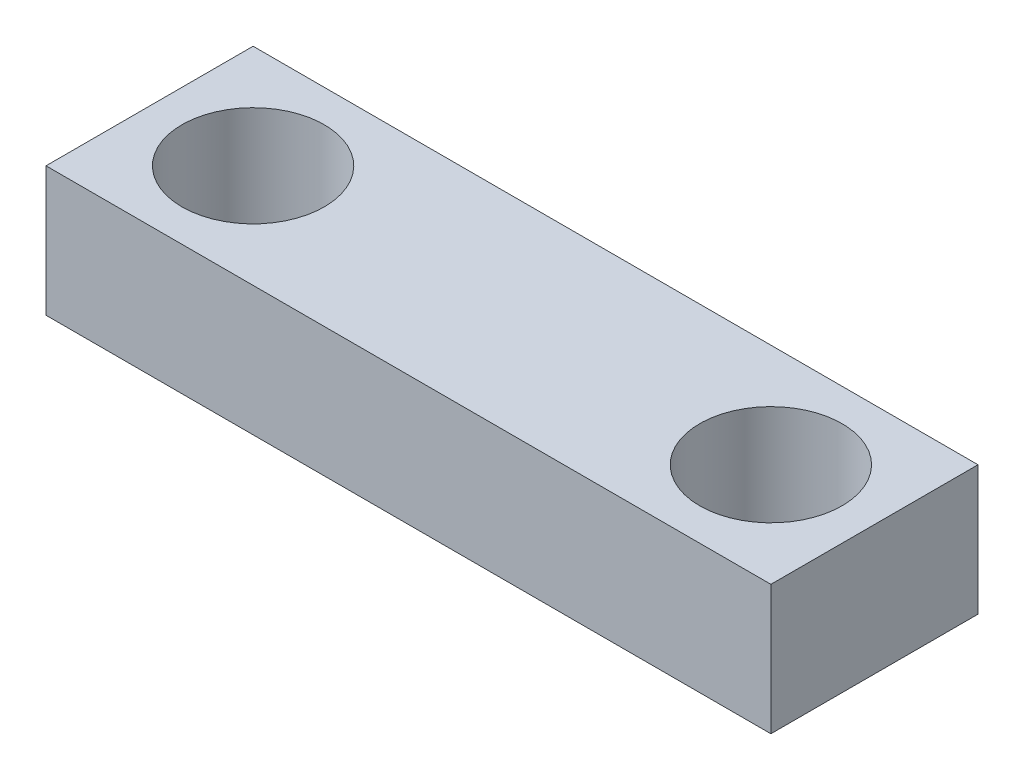
ISO-10303-21;
HEADER;
FILE_DESCRIPTION(('STEP AP214'),'2;1');
FILE_NAME('part.step','',(''),(''),'','','');
FILE_SCHEMA(('AUTOMOTIVE_DESIGN { 1 0 10303 214 1 1 1 1 }'));
ENDSEC;
DATA;
#1=APPLICATION_CONTEXT('core data for automotive mechanical design processes');
#2=APPLICATION_PROTOCOL_DEFINITION('international standard','automotive_design',2000,#1);
#3=PRODUCT_CONTEXT('',#1,'mechanical');
#4=PRODUCT('Part','Part','',(#3));
#5=PRODUCT_RELATED_PRODUCT_CATEGORY('part','',(#4));
#6=PRODUCT_DEFINITION_FORMATION('','',#4);
#7=PRODUCT_DEFINITION_CONTEXT('part definition',#1,'design');
#8=PRODUCT_DEFINITION('design','',#6,#7);
#9=PRODUCT_DEFINITION_SHAPE('','',#8);
#10=(LENGTH_UNIT() NAMED_UNIT(*) SI_UNIT(.MILLI.,.METRE.));
#11=(NAMED_UNIT(*) PLANE_ANGLE_UNIT() SI_UNIT($,.RADIAN.));
#12=(NAMED_UNIT(*) SI_UNIT($,.STERADIAN.) SOLID_ANGLE_UNIT());
#13=UNCERTAINTY_MEASURE_WITH_UNIT(LENGTH_MEASURE(1.E-05),#10,'distance_accuracy_value','');
#14=(GEOMETRIC_REPRESENTATION_CONTEXT(3) GLOBAL_UNCERTAINTY_ASSIGNED_CONTEXT((#13)) GLOBAL_UNIT_ASSIGNED_CONTEXT((#10,
#11,#12)) REPRESENTATION_CONTEXT('',''));
#15=CARTESIAN_POINT('',(0.,0.,0.));
#16=DIRECTION('',(0.,0.,1.));
#17=DIRECTION('',(1.,0.,0.));
#18=AXIS2_PLACEMENT_3D('',#15,#16,#17);
#19=CARTESIAN_POINT('',(0.,5.,0.));
#20=DIRECTION('',(0.,-1.,0.));
#21=DIRECTION('',(0.,0.,-1.));
#22=AXIS2_PLACEMENT_3D('',#19,#20,#21);
#23=PLANE('',#22);
#24=DIRECTION('',(0.,0.,-1.));
#25=VECTOR('',#24,1.);
#26=CARTESIAN_POINT('',(14.,5.,4.));
#27=LINE('',#26,#25);
#28=CARTESIAN_POINT('',(14.,5.,4.));
#29=VERTEX_POINT('',#28);
#30=CARTESIAN_POINT('',(14.,5.,-4.));
#31=VERTEX_POINT('',#30);
#32=EDGE_CURVE('E98',#29,#31,#27,.T.);
#33=ORIENTED_EDGE('',*,*,#32,.T.);
#34=DIRECTION('',(-1.,0.,0.));
#35=VECTOR('',#34,1.);
#36=CARTESIAN_POINT('',(-14.,5.,-4.));
#37=LINE('',#36,#35);
#38=CARTESIAN_POINT('',(-14.,5.,-4.));
#39=VERTEX_POINT('',#38);
#40=EDGE_CURVE('E93',#31,#39,#37,.T.);
#41=ORIENTED_EDGE('',*,*,#40,.T.);
#42=DIRECTION('',(0.,0.,1.));
#43=VECTOR('',#42,1.);
#44=CARTESIAN_POINT('',(-14.,5.,4.));
#45=LINE('',#44,#43);
#46=CARTESIAN_POINT('',(-14.,5.,4.));
#47=VERTEX_POINT('',#46);
#48=EDGE_CURVE('E96',#39,#47,#45,.T.);
#49=ORIENTED_EDGE('',*,*,#48,.T.);
#50=DIRECTION('',(1.,0.,0.));
#51=VECTOR('',#50,1.);
#52=CARTESIAN_POINT('',(-14.,5.,4.));
#53=LINE('',#52,#51);
#54=EDGE_CURVE('E63',#47,#29,#53,.T.);
#55=ORIENTED_EDGE('',*,*,#54,.T.);
#56=EDGE_LOOP('',(#33,#41,#49,#55));
#57=FACE_BOUND('',#56,.T.);
#58=CARTESIAN_POINT('',(10.,5.,0.));
#59=DIRECTION('',(0.,1.,0.));
#60=DIRECTION('',(0.,0.,1.));
#61=AXIS2_PLACEMENT_3D('',#58,#59,#60);
#62=CIRCLE('',#61,2.75);
#63=CARTESIAN_POINT('',(10.,5.,2.75));
#64=VERTEX_POINT('',#63);
#65=EDGE_CURVE('E119',#64,#64,#62,.T.);
#66=ORIENTED_EDGE('',*,*,#65,.F.);
#67=EDGE_LOOP('',(#66));
#68=FACE_BOUND('',#67,.T.);
#69=CARTESIAN_POINT('',(-10.,5.,0.));
#70=DIRECTION('',(0.,1.,0.));
#71=DIRECTION('',(0.,0.,1.));
#72=AXIS2_PLACEMENT_3D('',#69,#70,#71);
#73=CIRCLE('',#72,2.75);
#74=CARTESIAN_POINT('',(-10.,5.,2.75));
#75=VERTEX_POINT('',#74);
#76=EDGE_CURVE('E143',#75,#75,#73,.T.);
#77=ORIENTED_EDGE('',*,*,#76,.F.);
#78=EDGE_LOOP('',(#77));
#79=FACE_BOUND('',#78,.T.);
#80=ADVANCED_FACE('F45',(#57,#68,#79),#23,.F.);
#81=CARTESIAN_POINT('',(0.,0.,0.));
#82=DIRECTION('',(0.,-1.,0.));
#83=DIRECTION('',(0.,0.,-1.));
#84=AXIS2_PLACEMENT_3D('',#81,#82,#83);
#85=PLANE('',#84);
#86=CARTESIAN_POINT('',(10.,0.,0.));
#87=DIRECTION('',(0.,1.,0.));
#88=DIRECTION('',(0.,0.,1.));
#89=AXIS2_PLACEMENT_3D('',#86,#87,#88);
#90=CIRCLE('',#89,2.75);
#91=CARTESIAN_POINT('',(10.,0.,2.75));
#92=VERTEX_POINT('',#91);
#93=EDGE_CURVE('E139',#92,#92,#90,.T.);
#94=ORIENTED_EDGE('',*,*,#93,.T.);
#95=EDGE_LOOP('',(#94));
#96=FACE_BOUND('',#95,.T.);
#97=DIRECTION('',(0.,0.,-1.));
#98=VECTOR('',#97,1.);
#99=CARTESIAN_POINT('',(14.,0.,4.));
#100=LINE('',#99,#98);
#101=CARTESIAN_POINT('',(14.,0.,4.));
#102=VERTEX_POINT('',#101);
#103=CARTESIAN_POINT('',(14.,0.,-4.));
#104=VERTEX_POINT('',#103);
#105=EDGE_CURVE('E115',#102,#104,#100,.T.);
#106=ORIENTED_EDGE('',*,*,#105,.F.);
#107=DIRECTION('',(1.,0.,0.));
#108=VECTOR('',#107,1.);
#109=CARTESIAN_POINT('',(-14.,0.,4.));
#110=LINE('',#109,#108);
#111=CARTESIAN_POINT('',(-14.,0.,4.));
#112=VERTEX_POINT('',#111);
#113=EDGE_CURVE('E86',#112,#102,#110,.T.);
#114=ORIENTED_EDGE('',*,*,#113,.F.);
#115=DIRECTION('',(0.,0.,1.));
#116=VECTOR('',#115,1.);
#117=CARTESIAN_POINT('',(-14.,0.,4.));
#118=LINE('',#117,#116);
#119=CARTESIAN_POINT('',(-14.,0.,-4.));
#120=VERTEX_POINT('',#119);
#121=EDGE_CURVE('E80',#120,#112,#118,.T.);
#122=ORIENTED_EDGE('',*,*,#121,.F.);
#123=DIRECTION('',(-1.,0.,0.));
#124=VECTOR('',#123,1.);
#125=CARTESIAN_POINT('',(-14.,0.,-4.));
#126=LINE('',#125,#124);
#127=EDGE_CURVE('E103',#104,#120,#126,.T.);
#128=ORIENTED_EDGE('',*,*,#127,.F.);
#129=EDGE_LOOP('',(#106,#114,#122,#128));
#130=FACE_BOUND('',#129,.T.);
#131=CARTESIAN_POINT('',(-10.,0.,0.));
#132=DIRECTION('',(0.,1.,0.));
#133=DIRECTION('',(0.,0.,1.));
#134=AXIS2_PLACEMENT_3D('',#131,#132,#133);
#135=CIRCLE('',#134,2.75);
#136=CARTESIAN_POINT('',(-10.,0.,2.75));
#137=VERTEX_POINT('',#136);
#138=EDGE_CURVE('E147',#137,#137,#135,.T.);
#139=ORIENTED_EDGE('',*,*,#138,.T.);
#140=EDGE_LOOP('',(#139));
#141=FACE_BOUND('',#140,.T.);
#142=ADVANCED_FACE('F133',(#96,#130,#141),#85,.T.);
#143=CARTESIAN_POINT('',(14.,5.,4.));
#144=DIRECTION('',(-1.,0.,0.));
#145=DIRECTION('',(0.,0.,1.));
#146=AXIS2_PLACEMENT_3D('',#143,#144,#145);
#147=PLANE('',#146);
#148=ORIENTED_EDGE('',*,*,#105,.T.);
#149=DIRECTION('',(0.,-1.,0.));
#150=VECTOR('',#149,1.);
#151=CARTESIAN_POINT('',(14.,5.,-4.));
#152=LINE('',#151,#150);
#153=EDGE_CURVE('E11',#31,#104,#152,.T.);
#154=ORIENTED_EDGE('',*,*,#153,.F.);
#155=ORIENTED_EDGE('',*,*,#32,.F.);
#156=DIRECTION('',(0.,-1.,0.));
#157=VECTOR('',#156,1.);
#158=CARTESIAN_POINT('',(14.,5.,4.));
#159=LINE('',#158,#157);
#160=EDGE_CURVE('E111',#29,#102,#159,.T.);
#161=ORIENTED_EDGE('',*,*,#160,.T.);
#162=EDGE_LOOP('',(#148,#154,#155,#161));
#163=FACE_BOUND('',#162,.T.);
#164=ADVANCED_FACE('F47',(#163),#147,.F.);
#165=CARTESIAN_POINT('',(-14.,5.,-4.));
#166=DIRECTION('',(0.,0.,1.));
#167=DIRECTION('',(1.,0.,0.));
#168=AXIS2_PLACEMENT_3D('',#165,#166,#167);
#169=PLANE('',#168);
#170=ORIENTED_EDGE('',*,*,#127,.T.);
#171=DIRECTION('',(0.,-1.,0.));
#172=VECTOR('',#171,1.);
#173=CARTESIAN_POINT('',(-14.,5.,-4.));
#174=LINE('',#173,#172);
#175=EDGE_CURVE('E55',#39,#120,#174,.T.);
#176=ORIENTED_EDGE('',*,*,#175,.F.);
#177=ORIENTED_EDGE('',*,*,#40,.F.);
#178=ORIENTED_EDGE('',*,*,#153,.T.);
#179=EDGE_LOOP('',(#170,#176,#177,#178));
#180=FACE_BOUND('',#179,.T.);
#181=ADVANCED_FACE('F102',(#180),#169,.F.);
#182=CARTESIAN_POINT('',(-14.,5.,4.));
#183=DIRECTION('',(1.,0.,0.));
#184=DIRECTION('',(0.,0.,-1.));
#185=AXIS2_PLACEMENT_3D('',#182,#183,#184);
#186=PLANE('',#185);
#187=ORIENTED_EDGE('',*,*,#121,.T.);
#188=DIRECTION('',(0.,-1.,0.));
#189=VECTOR('',#188,1.);
#190=CARTESIAN_POINT('',(-14.,5.,4.));
#191=LINE('',#190,#189);
#192=EDGE_CURVE('E105',#47,#112,#191,.T.);
#193=ORIENTED_EDGE('',*,*,#192,.F.);
#194=ORIENTED_EDGE('',*,*,#48,.F.);
#195=ORIENTED_EDGE('',*,*,#175,.T.);
#196=EDGE_LOOP('',(#187,#193,#194,#195));
#197=FACE_BOUND('',#196,.T.);
#198=ADVANCED_FACE('F106',(#197),#186,.F.);
#199=CARTESIAN_POINT('',(-14.,5.,4.));
#200=DIRECTION('',(0.,0.,-1.));
#201=DIRECTION('',(-1.,0.,0.));
#202=AXIS2_PLACEMENT_3D('',#199,#200,#201);
#203=PLANE('',#202);
#204=ORIENTED_EDGE('',*,*,#113,.T.);
#205=ORIENTED_EDGE('',*,*,#160,.F.);
#206=ORIENTED_EDGE('',*,*,#54,.F.);
#207=ORIENTED_EDGE('',*,*,#192,.T.);
#208=EDGE_LOOP('',(#204,#205,#206,#207));
#209=FACE_BOUND('',#208,.T.);
#210=ADVANCED_FACE('F130',(#209),#203,.F.);
#211=CARTESIAN_POINT('',(10.,5.,0.));
#212=DIRECTION('',(0.,-1.,0.));
#213=DIRECTION('',(0.,0.,-1.));
#214=AXIS2_PLACEMENT_3D('',#211,#212,#213);
#215=CYLINDRICAL_SURFACE('',#214,2.75);
#216=ORIENTED_EDGE('',*,*,#65,.T.);
#217=EDGE_LOOP('',(#216));
#218=FACE_BOUND('',#217,.T.);
#219=ORIENTED_EDGE('',*,*,#93,.F.);
#220=EDGE_LOOP('',(#219));
#221=FACE_BOUND('',#220,.T.);
#222=ADVANCED_FACE('F167',(#218,#221),#215,.F.);
#223=CARTESIAN_POINT('',(-10.,5.,0.));
#224=DIRECTION('',(0.,-1.,0.));
#225=DIRECTION('',(0.,0.,-1.));
#226=AXIS2_PLACEMENT_3D('',#223,#224,#225);
#227=CYLINDRICAL_SURFACE('',#226,2.75);
#228=ORIENTED_EDGE('',*,*,#76,.T.);
#229=EDGE_LOOP('',(#228));
#230=FACE_BOUND('',#229,.T.);
#231=ORIENTED_EDGE('',*,*,#138,.F.);
#232=EDGE_LOOP('',(#231));
#233=FACE_BOUND('',#232,.T.);
#234=ADVANCED_FACE('F156',(#230,#233),#227,.F.);
#235=CLOSED_SHELL('',(#80,#142,#164,#181,#198,#210,#222,#234));
#236=MANIFOLD_SOLID_BREP('B2',#235);
#237=ADVANCED_BREP_SHAPE_REPRESENTATION('',(#18,#236),#14);
#238=SHAPE_DEFINITION_REPRESENTATION(#9,#237);
ENDSEC;
END-ISO-10303-21;
